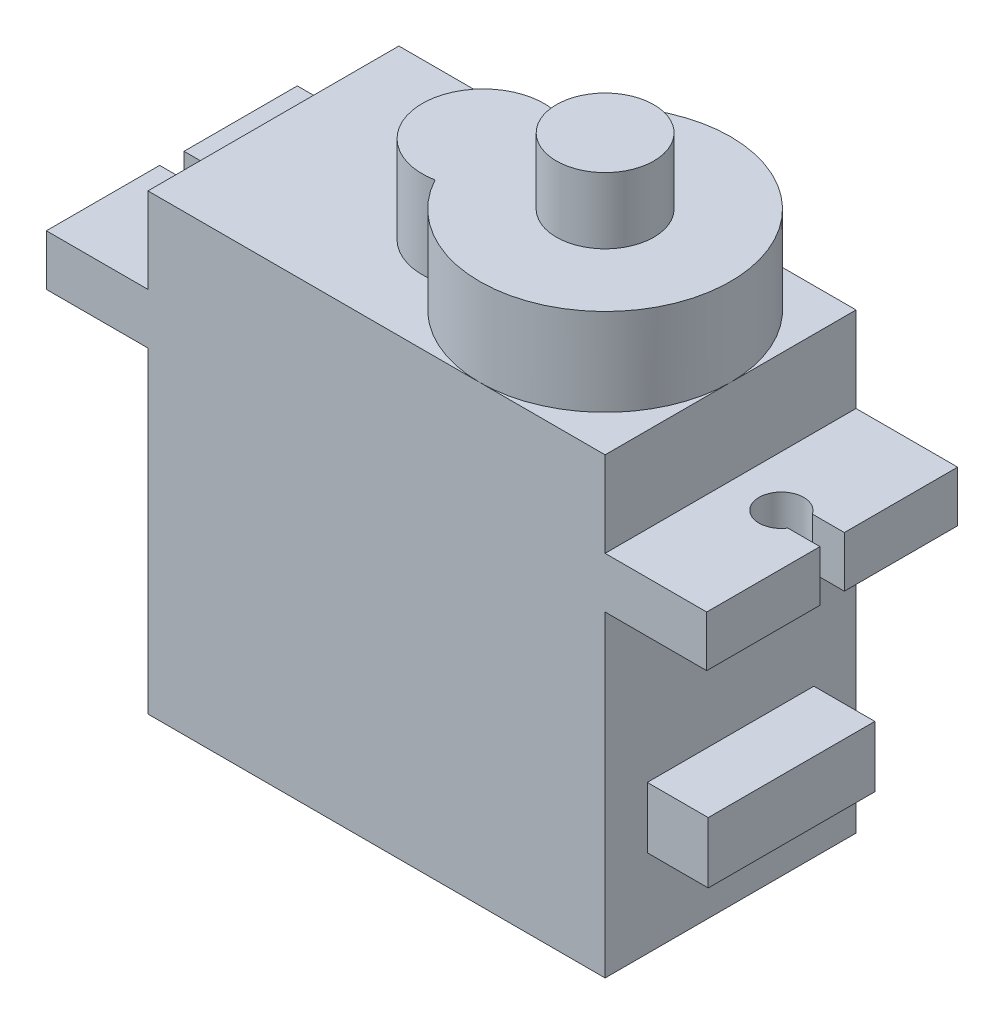
ISO-10303-21;
HEADER;
FILE_DESCRIPTION(('STEP AP214'),'2;1');
FILE_NAME('part.step','',(''),(''),'','','');
FILE_SCHEMA(('AUTOMOTIVE_DESIGN { 1 0 10303 214 1 1 1 1 }'));
ENDSEC;
DATA;
#1=APPLICATION_CONTEXT('core data for automotive mechanical design processes');
#2=APPLICATION_PROTOCOL_DEFINITION('international standard','automotive_design',2000,#1);
#3=PRODUCT_CONTEXT('',#1,'mechanical');
#4=PRODUCT('Part','Part','',(#3));
#5=PRODUCT_RELATED_PRODUCT_CATEGORY('part','',(#4));
#6=PRODUCT_DEFINITION_FORMATION('','',#4);
#7=PRODUCT_DEFINITION_CONTEXT('part definition',#1,'design');
#8=PRODUCT_DEFINITION('design','',#6,#7);
#9=PRODUCT_DEFINITION_SHAPE('','',#8);
#10=(LENGTH_UNIT() NAMED_UNIT(*) SI_UNIT(.MILLI.,.METRE.));
#11=(NAMED_UNIT(*) PLANE_ANGLE_UNIT() SI_UNIT($,.RADIAN.));
#12=(NAMED_UNIT(*) SI_UNIT($,.STERADIAN.) SOLID_ANGLE_UNIT());
#13=UNCERTAINTY_MEASURE_WITH_UNIT(LENGTH_MEASURE(1.E-05),#10,'distance_accuracy_value','');
#14=(GEOMETRIC_REPRESENTATION_CONTEXT(3) GLOBAL_UNCERTAINTY_ASSIGNED_CONTEXT((#13)) GLOBAL_UNIT_ASSIGNED_CONTEXT((#10,
#11,#12)) REPRESENTATION_CONTEXT('',''));
#15=CARTESIAN_POINT('',(0.,0.,0.));
#16=DIRECTION('',(0.,0.,1.));
#17=DIRECTION('',(1.,0.,0.));
#18=AXIS2_PLACEMENT_3D('',#15,#16,#17);
#19=CARTESIAN_POINT('',(27.5,18.1,12.35));
#20=DIRECTION('',(-1.,0.,0.));
#21=DIRECTION('',(0.,0.,1.));
#22=AXIS2_PLACEMENT_3D('',#19,#20,#21);
#23=PLANE('',#22);
#24=DIRECTION('',(0.,0.,-1.));
#25=VECTOR('',#24,1.);
#26=CARTESIAN_POINT('',(27.5,18.1,12.35));
#27=LINE('',#26,#25);
#28=CARTESIAN_POINT('',(27.5,18.1,5.575));
#29=VERTEX_POINT('',#28);
#30=CARTESIAN_POINT('',(27.5,18.1,0.));
#31=VERTEX_POINT('',#30);
#32=EDGE_CURVE('E243',#29,#31,#27,.T.);
#33=ORIENTED_EDGE('',*,*,#32,.F.);
#34=DIRECTION('',(0.,1.,0.));
#35=VECTOR('',#34,1.);
#36=CARTESIAN_POINT('',(27.5,15.1,5.575));
#37=LINE('',#36,#35);
#38=CARTESIAN_POINT('',(27.5,15.6,5.575));
#39=VERTEX_POINT('',#38);
#40=EDGE_CURVE('E237',#39,#29,#37,.T.);
#41=ORIENTED_EDGE('',*,*,#40,.F.);
#42=DIRECTION('',(0.,0.,-1.));
#43=VECTOR('',#42,1.);
#44=CARTESIAN_POINT('',(27.5,15.6,12.35));
#45=LINE('',#44,#43);
#46=CARTESIAN_POINT('',(27.5,15.6,0.));
#47=VERTEX_POINT('',#46);
#48=EDGE_CURVE('E242',#39,#47,#45,.T.);
#49=ORIENTED_EDGE('',*,*,#48,.T.);
#50=DIRECTION('',(0.,1.,0.));
#51=VECTOR('',#50,1.);
#52=CARTESIAN_POINT('',(27.5,18.1,0.));
#53=LINE('',#52,#51);
#54=EDGE_CURVE('E393',#47,#31,#53,.T.);
#55=ORIENTED_EDGE('',*,*,#54,.T.);
#56=EDGE_LOOP('',(#33,#41,#49,#55));
#57=FACE_BOUND('',#56,.T.);
#58=ADVANCED_FACE('F36',(#57),#23,.F.);
#59=CARTESIAN_POINT('',(-5.,18.1,12.35));
#60=DIRECTION('',(1.,0.,0.));
#61=DIRECTION('',(0.,0.,-1.));
#62=AXIS2_PLACEMENT_3D('',#59,#60,#61);
#63=PLANE('',#62);
#64=DIRECTION('',(0.,0.,-1.));
#65=VECTOR('',#64,1.);
#66=CARTESIAN_POINT('',(-5.,18.1,12.35));
#67=LINE('',#66,#65);
#68=CARTESIAN_POINT('',(-5.,18.1,12.35));
#69=VERTEX_POINT('',#68);
#70=CARTESIAN_POINT('',(-5.,18.1,6.775));
#71=VERTEX_POINT('',#70);
#72=EDGE_CURVE('E420',#69,#71,#67,.T.);
#73=ORIENTED_EDGE('',*,*,#72,.T.);
#74=DIRECTION('',(0.,1.,0.));
#75=VECTOR('',#74,1.);
#76=CARTESIAN_POINT('',(-5.,15.1,6.775));
#77=LINE('',#76,#75);
#78=CARTESIAN_POINT('',(-5.,15.6,6.775));
#79=VERTEX_POINT('',#78);
#80=EDGE_CURVE('E281',#79,#71,#77,.T.);
#81=ORIENTED_EDGE('',*,*,#80,.F.);
#82=DIRECTION('',(0.,0.,-1.));
#83=VECTOR('',#82,1.);
#84=CARTESIAN_POINT('',(-5.,15.6,12.35));
#85=LINE('',#84,#83);
#86=CARTESIAN_POINT('',(-5.,15.6,12.35));
#87=VERTEX_POINT('',#86);
#88=EDGE_CURVE('E417',#87,#79,#85,.T.);
#89=ORIENTED_EDGE('',*,*,#88,.F.);
#90=DIRECTION('',(0.,-1.,0.));
#91=VECTOR('',#90,1.);
#92=CARTESIAN_POINT('',(-5.,18.1,12.35));
#93=LINE('',#92,#91);
#94=EDGE_CURVE('E379',#69,#87,#93,.T.);
#95=ORIENTED_EDGE('',*,*,#94,.F.);
#96=EDGE_LOOP('',(#73,#81,#89,#95));
#97=FACE_BOUND('',#96,.T.);
#98=ADVANCED_FACE('F487',(#97),#63,.F.);
#99=CARTESIAN_POINT('',(22.5,0.,12.35));
#100=DIRECTION('',(-1.,0.,0.));
#101=DIRECTION('',(0.,-1.,0.));
#102=AXIS2_PLACEMENT_3D('',#99,#100,#101);
#103=PLANE('',#102);
#104=DIRECTION('',(0.,1.,0.));
#105=VECTOR('',#104,1.);
#106=CARTESIAN_POINT('',(22.5,0.,0.));
#107=LINE('',#106,#105);
#108=CARTESIAN_POINT('',(22.5,0.,0.));
#109=VERTEX_POINT('',#108);
#110=CARTESIAN_POINT('',(22.5,15.6,0.));
#111=VERTEX_POINT('',#110);
#112=EDGE_CURVE('E388',#109,#111,#107,.T.);
#113=ORIENTED_EDGE('',*,*,#112,.T.);
#114=DIRECTION('',(0.,0.,-1.));
#115=VECTOR('',#114,1.);
#116=CARTESIAN_POINT('',(22.5,15.6,12.35));
#117=LINE('',#116,#115);
#118=CARTESIAN_POINT('',(22.5,15.6,12.35));
#119=VERTEX_POINT('',#118);
#120=EDGE_CURVE('E250',#119,#111,#117,.T.);
#121=ORIENTED_EDGE('',*,*,#120,.F.);
#122=DIRECTION('',(0.,1.,0.));
#123=VECTOR('',#122,1.);
#124=CARTESIAN_POINT('',(22.5,0.,12.35));
#125=LINE('',#124,#123);
#126=CARTESIAN_POINT('',(22.5,0.,12.35));
#127=VERTEX_POINT('',#126);
#128=EDGE_CURVE('E362',#127,#119,#125,.T.);
#129=ORIENTED_EDGE('',*,*,#128,.F.);
#130=DIRECTION('',(0.,0.,-1.));
#131=VECTOR('',#130,1.);
#132=CARTESIAN_POINT('',(22.5,0.,12.35));
#133=LINE('',#132,#131);
#134=EDGE_CURVE('E253',#127,#109,#133,.T.);
#135=ORIENTED_EDGE('',*,*,#134,.T.);
#136=EDGE_LOOP('',(#113,#121,#129,#135));
#137=FACE_BOUND('',#136,.T.);
#138=DIRECTION('',(0.,-1.,0.));
#139=VECTOR('',#138,1.);
#140=CARTESIAN_POINT('',(22.5,7.30000000000001,10.275));
#141=LINE('',#140,#139);
#142=CARTESIAN_POINT('',(22.5,7.30000000000001,10.275));
#143=VERTEX_POINT('',#142);
#144=CARTESIAN_POINT('',(22.5,4.30000000000001,10.275));
#145=VERTEX_POINT('',#144);
#146=EDGE_CURVE('E299',#143,#145,#141,.T.);
#147=ORIENTED_EDGE('',*,*,#146,.F.);
#148=DIRECTION('',(0.,0.,1.));
#149=VECTOR('',#148,1.);
#150=CARTESIAN_POINT('',(22.5,7.30000000000001,10.275));
#151=LINE('',#150,#149);
#152=CARTESIAN_POINT('',(22.5,7.30000000000001,2.075));
#153=VERTEX_POINT('',#152);
#154=EDGE_CURVE('E304',#153,#143,#151,.T.);
#155=ORIENTED_EDGE('',*,*,#154,.F.);
#156=DIRECTION('',(0.,1.,0.));
#157=VECTOR('',#156,1.);
#158=CARTESIAN_POINT('',(22.5,7.30000000000001,2.075));
#159=LINE('',#158,#157);
#160=CARTESIAN_POINT('',(22.5,4.30000000000001,2.075));
#161=VERTEX_POINT('',#160);
#162=EDGE_CURVE('E316',#161,#153,#159,.T.);
#163=ORIENTED_EDGE('',*,*,#162,.F.);
#164=DIRECTION('',(0.,0.,-1.));
#165=VECTOR('',#164,1.);
#166=CARTESIAN_POINT('',(22.5,4.30000000000001,10.275));
#167=LINE('',#166,#165);
#168=EDGE_CURVE('E313',#145,#161,#167,.T.);
#169=ORIENTED_EDGE('',*,*,#168,.F.);
#170=EDGE_LOOP('',(#147,#155,#163,#169));
#171=FACE_BOUND('',#170,.T.);
#172=ADVANCED_FACE('F482',(#137,#171),#103,.F.);
#173=CARTESIAN_POINT('',(22.5,22.3,12.35));
#174=DIRECTION('',(0.,-1.,0.));
#175=DIRECTION('',(1.,0.,0.));
#176=AXIS2_PLACEMENT_3D('',#173,#174,#175);
#177=PLANE('',#176);
#178=CARTESIAN_POINT('',(10.325,22.3,6.175));
#179=DIRECTION('',(0.,1.,0.));
#180=DIRECTION('',(-1.,0.,0.));
#181=AXIS2_PLACEMENT_3D('',#178,#179,#180);
#182=CIRCLE('',#181,3.);
#183=CARTESIAN_POINT('',(10.8974479166667,22.3,3.23012251821845));
#184=VERTEX_POINT('',#183);
#185=CARTESIAN_POINT('',(10.8974479166667,22.3,9.11987748178154));
#186=VERTEX_POINT('',#185);
#187=EDGE_CURVE('E336',#184,#186,#182,.T.);
#188=ORIENTED_EDGE('',*,*,#187,.F.);
#189=CARTESIAN_POINT('',(16.325,22.3,6.175));
#190=DIRECTION('',(0.,1.,0.));
#191=DIRECTION('',(-1.,0.,0.));
#192=AXIS2_PLACEMENT_3D('',#189,#190,#191);
#193=CIRCLE('',#192,6.175);
#194=CARTESIAN_POINT('',(16.325,22.3,0.));
#195=VERTEX_POINT('',#194);
#196=EDGE_CURVE('E259',#195,#184,#193,.T.);
#197=ORIENTED_EDGE('',*,*,#196,.F.);
#198=DIRECTION('',(-1.,0.,0.));
#199=VECTOR('',#198,1.);
#200=CARTESIAN_POINT('',(22.5,22.3,0.));
#201=LINE('',#200,#199);
#202=CARTESIAN_POINT('',(0.,22.3,0.));
#203=VERTEX_POINT('',#202);
#204=EDGE_CURVE('E401',#195,#203,#201,.T.);
#205=ORIENTED_EDGE('',*,*,#204,.T.);
#206=DIRECTION('',(0.,0.,-1.));
#207=VECTOR('',#206,1.);
#208=CARTESIAN_POINT('',(0.,22.3,12.35));
#209=LINE('',#208,#207);
#210=CARTESIAN_POINT('',(0.,22.3,12.35));
#211=VERTEX_POINT('',#210);
#212=EDGE_CURVE('E426',#211,#203,#209,.T.);
#213=ORIENTED_EDGE('',*,*,#212,.F.);
#214=DIRECTION('',(-1.,0.,0.));
#215=VECTOR('',#214,1.);
#216=CARTESIAN_POINT('',(22.5,22.3,12.35));
#217=LINE('',#216,#215);
#218=CARTESIAN_POINT('',(16.325,22.3,12.35));
#219=VERTEX_POINT('',#218);
#220=EDGE_CURVE('E371',#219,#211,#217,.T.);
#221=ORIENTED_EDGE('',*,*,#220,.F.);
#222=EDGE_CURVE('E343',#186,#219,#193,.T.);
#223=ORIENTED_EDGE('',*,*,#222,.F.);
#224=EDGE_LOOP('',(#188,#197,#205,#213,#221,#223));
#225=FACE_BOUND('',#224,.T.);
#226=ADVANCED_FACE('F455',(#225),#177,.F.);
#227=CARTESIAN_POINT('',(22.5,22.3,6.175));
#228=VERTEX_POINT('',#227);
#229=EDGE_CURVE('E261',#219,#228,#193,.T.);
#230=ORIENTED_EDGE('',*,*,#229,.F.);
#231=CARTESIAN_POINT('',(22.5,22.3,12.35));
#232=VERTEX_POINT('',#231);
#233=EDGE_CURVE('E372',#232,#219,#217,.T.);
#234=ORIENTED_EDGE('',*,*,#233,.F.);
#235=DIRECTION('',(0.,0.,-1.));
#236=VECTOR('',#235,1.);
#237=CARTESIAN_POINT('',(22.5,22.3,12.35));
#238=LINE('',#237,#236);
#239=EDGE_CURVE('E429',#232,#228,#238,.T.);
#240=ORIENTED_EDGE('',*,*,#239,.T.);
#241=EDGE_LOOP('',(#230,#234,#240));
#242=FACE_BOUND('',#241,.T.);
#243=ADVANCED_FACE('F473',(#242),#177,.F.);
#244=CARTESIAN_POINT('',(0.,15.6,12.35));
#245=DIRECTION('',(1.,0.,0.));
#246=DIRECTION('',(0.,1.,0.));
#247=AXIS2_PLACEMENT_3D('',#244,#245,#246);
#248=PLANE('',#247);
#249=DIRECTION('',(0.,-1.,0.));
#250=VECTOR('',#249,1.);
#251=CARTESIAN_POINT('',(0.,15.6,0.));
#252=LINE('',#251,#250);
#253=CARTESIAN_POINT('',(0.,15.6,0.));
#254=VERTEX_POINT('',#253);
#255=CARTESIAN_POINT('',(0.,0.,0.));
#256=VERTEX_POINT('',#255);
#257=EDGE_CURVE('E355',#254,#256,#252,.T.);
#258=ORIENTED_EDGE('',*,*,#257,.T.);
#259=DIRECTION('',(0.,0.,-1.));
#260=VECTOR('',#259,1.);
#261=CARTESIAN_POINT('',(0.,0.,12.35));
#262=LINE('',#261,#260);
#263=CARTESIAN_POINT('',(0.,0.,12.35));
#264=VERTEX_POINT('',#263);
#265=EDGE_CURVE('E256',#264,#256,#262,.T.);
#266=ORIENTED_EDGE('',*,*,#265,.F.);
#267=DIRECTION('',(0.,-1.,0.));
#268=VECTOR('',#267,1.);
#269=CARTESIAN_POINT('',(0.,15.6,12.35));
#270=LINE('',#269,#268);
#271=CARTESIAN_POINT('',(0.,15.6,12.35));
#272=VERTEX_POINT('',#271);
#273=EDGE_CURVE('E356',#272,#264,#270,.T.);
#274=ORIENTED_EDGE('',*,*,#273,.F.);
#275=DIRECTION('',(0.,0.,-1.));
#276=VECTOR('',#275,1.);
#277=CARTESIAN_POINT('',(0.,15.6,12.35));
#278=LINE('',#277,#276);
#279=EDGE_CURVE('E383',#272,#254,#278,.T.);
#280=ORIENTED_EDGE('',*,*,#279,.T.);
#281=EDGE_LOOP('',(#258,#266,#274,#280));
#282=FACE_BOUND('',#281,.T.);
#283=ADVANCED_FACE('F38',(#282),#248,.F.);
#284=CARTESIAN_POINT('',(0.,0.,12.35));
#285=DIRECTION('',(0.,1.,0.));
#286=DIRECTION('',(0.,0.,1.));
#287=AXIS2_PLACEMENT_3D('',#284,#285,#286);
#288=PLANE('',#287);
#289=DIRECTION('',(1.,0.,0.));
#290=VECTOR('',#289,1.);
#291=CARTESIAN_POINT('',(0.,0.,0.));
#292=LINE('',#291,#290);
#293=EDGE_CURVE('E386',#256,#109,#292,.T.);
#294=ORIENTED_EDGE('',*,*,#293,.T.);
#295=ORIENTED_EDGE('',*,*,#134,.F.);
#296=DIRECTION('',(1.,0.,0.));
#297=VECTOR('',#296,1.);
#298=CARTESIAN_POINT('',(0.,0.,12.35));
#299=LINE('',#298,#297);
#300=EDGE_CURVE('E359',#264,#127,#299,.T.);
#301=ORIENTED_EDGE('',*,*,#300,.F.);
#302=ORIENTED_EDGE('',*,*,#265,.T.);
#303=EDGE_LOOP('',(#294,#295,#301,#302));
#304=FACE_BOUND('',#303,.T.);
#305=ADVANCED_FACE('F480',(#304),#288,.F.);
#306=CARTESIAN_POINT('',(27.5,15.6,12.35));
#307=DIRECTION('',(0.,1.,0.));
#308=DIRECTION('',(0.,0.,1.));
#309=AXIS2_PLACEMENT_3D('',#306,#307,#308);
#310=PLANE('',#309);
#311=ORIENTED_EDGE('',*,*,#48,.F.);
#312=DIRECTION('',(-1.,0.,0.));
#313=VECTOR('',#312,1.);
#314=CARTESIAN_POINT('',(27.5,15.6,5.575));
#315=LINE('',#314,#313);
#316=CARTESIAN_POINT('',(25.9219544457293,15.6,5.575));
#317=VERTEX_POINT('',#316);
#318=EDGE_CURVE('E292',#39,#317,#315,.T.);
#319=ORIENTED_EDGE('',*,*,#318,.T.);
#320=CARTESIAN_POINT('',(25.,15.6,6.175));
#321=DIRECTION('',(0.,1.,0.));
#322=DIRECTION('',(0.,0.,1.));
#323=AXIS2_PLACEMENT_3D('',#320,#321,#322);
#324=CIRCLE('',#323,1.1);
#325=CARTESIAN_POINT('',(25.9219544457293,15.6,6.775));
#326=VERTEX_POINT('',#325);
#327=EDGE_CURVE('E296',#317,#326,#324,.T.);
#328=ORIENTED_EDGE('',*,*,#327,.T.);
#329=DIRECTION('',(1.,0.,0.));
#330=VECTOR('',#329,1.);
#331=CARTESIAN_POINT('',(27.5,15.6,6.775));
#332=LINE('',#331,#330);
#333=CARTESIAN_POINT('',(27.5,15.6,6.775));
#334=VERTEX_POINT('',#333);
#335=EDGE_CURVE('E290',#326,#334,#332,.T.);
#336=ORIENTED_EDGE('',*,*,#335,.T.);
#337=CARTESIAN_POINT('',(27.5,15.6,12.35));
#338=VERTEX_POINT('',#337);
#339=EDGE_CURVE('E236',#338,#334,#45,.T.);
#340=ORIENTED_EDGE('',*,*,#339,.F.);
#341=DIRECTION('',(1.,0.,0.));
#342=VECTOR('',#341,1.);
#343=CARTESIAN_POINT('',(27.5,15.6,12.35));
#344=LINE('',#343,#342);
#345=EDGE_CURVE('E364',#119,#338,#344,.T.);
#346=ORIENTED_EDGE('',*,*,#345,.F.);
#347=ORIENTED_EDGE('',*,*,#120,.T.);
#348=DIRECTION('',(1.,0.,0.));
#349=VECTOR('',#348,1.);
#350=CARTESIAN_POINT('',(27.5,15.6,0.));
#351=LINE('',#350,#349);
#352=EDGE_CURVE('E390',#111,#47,#351,.T.);
#353=ORIENTED_EDGE('',*,*,#352,.T.);
#354=EDGE_LOOP('',(#311,#319,#328,#336,#340,#346,#347,#353));
#355=FACE_BOUND('',#354,.T.);
#356=ADVANCED_FACE('F500',(#355),#310,.F.);
#357=ORIENTED_EDGE('',*,*,#339,.T.);
#358=DIRECTION('',(0.,1.,0.));
#359=VECTOR('',#358,1.);
#360=CARTESIAN_POINT('',(27.5,15.1,6.775));
#361=LINE('',#360,#359);
#362=CARTESIAN_POINT('',(27.5,18.1,6.775));
#363=VERTEX_POINT('',#362);
#364=EDGE_CURVE('E221',#334,#363,#361,.T.);
#365=ORIENTED_EDGE('',*,*,#364,.T.);
#366=CARTESIAN_POINT('',(27.5,18.1,12.35));
#367=VERTEX_POINT('',#366);
#368=EDGE_CURVE('E233',#367,#363,#27,.T.);
#369=ORIENTED_EDGE('',*,*,#368,.F.);
#370=DIRECTION('',(0.,1.,0.));
#371=VECTOR('',#370,1.);
#372=CARTESIAN_POINT('',(27.5,18.1,12.35));
#373=LINE('',#372,#371);
#374=EDGE_CURVE('E366',#338,#367,#373,.T.);
#375=ORIENTED_EDGE('',*,*,#374,.F.);
#376=EDGE_LOOP('',(#357,#365,#369,#375));
#377=FACE_BOUND('',#376,.T.);
#378=ADVANCED_FACE('F231',(#377),#23,.F.);
#379=CARTESIAN_POINT('',(22.5,18.1,12.35));
#380=DIRECTION('',(0.,-1.,0.));
#381=DIRECTION('',(1.,0.,0.));
#382=AXIS2_PLACEMENT_3D('',#379,#380,#381);
#383=PLANE('',#382);
#384=CARTESIAN_POINT('',(25.,18.1,6.175));
#385=DIRECTION('',(0.,1.,0.));
#386=DIRECTION('',(-1.,0.,0.));
#387=AXIS2_PLACEMENT_3D('',#384,#385,#386);
#388=CIRCLE('',#387,1.1);
#389=CARTESIAN_POINT('',(25.9219544457293,18.1,5.575));
#390=VERTEX_POINT('',#389);
#391=CARTESIAN_POINT('',(25.9219544457293,18.1,6.775));
#392=VERTEX_POINT('',#391);
#393=EDGE_CURVE('E51',#390,#392,#388,.T.);
#394=ORIENTED_EDGE('',*,*,#393,.F.);
#395=DIRECTION('',(-1.,0.,0.));
#396=VECTOR('',#395,1.);
#397=CARTESIAN_POINT('',(27.5,18.1,5.575));
#398=LINE('',#397,#396);
#399=EDGE_CURVE('E226',#29,#390,#398,.T.);
#400=ORIENTED_EDGE('',*,*,#399,.F.);
#401=ORIENTED_EDGE('',*,*,#32,.T.);
#402=DIRECTION('',(-1.,0.,0.));
#403=VECTOR('',#402,1.);
#404=CARTESIAN_POINT('',(22.5,18.1,0.));
#405=LINE('',#404,#403);
#406=CARTESIAN_POINT('',(22.5,18.1,0.));
#407=VERTEX_POINT('',#406);
#408=EDGE_CURVE('E396',#31,#407,#405,.T.);
#409=ORIENTED_EDGE('',*,*,#408,.T.);
#410=DIRECTION('',(0.,0.,-1.));
#411=VECTOR('',#410,1.);
#412=CARTESIAN_POINT('',(22.5,18.1,12.35));
#413=LINE('',#412,#411);
#414=CARTESIAN_POINT('',(22.5,18.1,12.35));
#415=VERTEX_POINT('',#414);
#416=EDGE_CURVE('E246',#415,#407,#413,.T.);
#417=ORIENTED_EDGE('',*,*,#416,.F.);
#418=DIRECTION('',(-1.,0.,0.));
#419=VECTOR('',#418,1.);
#420=CARTESIAN_POINT('',(22.5,18.1,12.35));
#421=LINE('',#420,#419);
#422=EDGE_CURVE('E241',#367,#415,#421,.T.);
#423=ORIENTED_EDGE('',*,*,#422,.F.);
#424=ORIENTED_EDGE('',*,*,#368,.T.);
#425=DIRECTION('',(1.,0.,0.));
#426=VECTOR('',#425,1.);
#427=CARTESIAN_POINT('',(25.9219544457293,18.1,6.775));
#428=LINE('',#427,#426);
#429=EDGE_CURVE('E218',#392,#363,#428,.T.);
#430=ORIENTED_EDGE('',*,*,#429,.F.);
#431=EDGE_LOOP('',(#394,#400,#401,#409,#417,#423,#424,#430));
#432=FACE_BOUND('',#431,.T.);
#433=ADVANCED_FACE('F239',(#432),#383,.F.);
#434=CARTESIAN_POINT('',(22.5,18.1,12.35));
#435=DIRECTION('',(-1.,0.,0.));
#436=DIRECTION('',(0.,0.,1.));
#437=AXIS2_PLACEMENT_3D('',#434,#435,#436);
#438=PLANE('',#437);
#439=DIRECTION('',(0.,1.,0.));
#440=VECTOR('',#439,1.);
#441=CARTESIAN_POINT('',(22.5,18.1,0.));
#442=LINE('',#441,#440);
#443=CARTESIAN_POINT('',(22.5,22.3,0.));
#444=VERTEX_POINT('',#443);
#445=EDGE_CURVE('E398',#407,#444,#442,.T.);
#446=ORIENTED_EDGE('',*,*,#445,.T.);
#447=EDGE_CURVE('E428',#228,#444,#238,.T.);
#448=ORIENTED_EDGE('',*,*,#447,.F.);
#449=ORIENTED_EDGE('',*,*,#239,.F.);
#450=DIRECTION('',(0.,1.,0.));
#451=VECTOR('',#450,1.);
#452=CARTESIAN_POINT('',(22.5,18.1,12.35));
#453=LINE('',#452,#451);
#454=EDGE_CURVE('E369',#415,#232,#453,.T.);
#455=ORIENTED_EDGE('',*,*,#454,.F.);
#456=ORIENTED_EDGE('',*,*,#416,.T.);
#457=EDGE_LOOP('',(#446,#448,#449,#455,#456));
#458=FACE_BOUND('',#457,.T.);
#459=ADVANCED_FACE('F444',(#458),#438,.F.);
#460=EDGE_CURVE('E441',#228,#195,#193,.T.);
#461=ORIENTED_EDGE('',*,*,#460,.F.);
#462=ORIENTED_EDGE('',*,*,#447,.T.);
#463=EDGE_CURVE('E402',#444,#195,#201,.T.);
#464=ORIENTED_EDGE('',*,*,#463,.T.);
#465=EDGE_LOOP('',(#461,#462,#464));
#466=FACE_BOUND('',#465,.T.);
#467=ADVANCED_FACE('F438',(#466),#177,.F.);
#468=CARTESIAN_POINT('',(0.,22.3,12.35));
#469=DIRECTION('',(1.,0.,0.));
#470=DIRECTION('',(0.,1.,0.));
#471=AXIS2_PLACEMENT_3D('',#468,#469,#470);
#472=PLANE('',#471);
#473=DIRECTION('',(0.,-1.,0.));
#474=VECTOR('',#473,1.);
#475=CARTESIAN_POINT('',(0.,22.3,0.));
#476=LINE('',#475,#474);
#477=CARTESIAN_POINT('',(0.,18.1,0.));
#478=VERTEX_POINT('',#477);
#479=EDGE_CURVE('E405',#203,#478,#476,.T.);
#480=ORIENTED_EDGE('',*,*,#479,.T.);
#481=DIRECTION('',(0.,0.,-1.));
#482=VECTOR('',#481,1.);
#483=CARTESIAN_POINT('',(0.,18.1,12.35));
#484=LINE('',#483,#482);
#485=CARTESIAN_POINT('',(0.,18.1,12.35));
#486=VERTEX_POINT('',#485);
#487=EDGE_CURVE('E423',#486,#478,#484,.T.);
#488=ORIENTED_EDGE('',*,*,#487,.F.);
#489=DIRECTION('',(0.,-1.,0.));
#490=VECTOR('',#489,1.);
#491=CARTESIAN_POINT('',(0.,22.3,12.35));
#492=LINE('',#491,#490);
#493=EDGE_CURVE('E375',#211,#486,#492,.T.);
#494=ORIENTED_EDGE('',*,*,#493,.F.);
#495=ORIENTED_EDGE('',*,*,#212,.T.);
#496=EDGE_LOOP('',(#480,#488,#494,#495));
#497=FACE_BOUND('',#496,.T.);
#498=ADVANCED_FACE('F460',(#497),#472,.F.);
#499=CARTESIAN_POINT('',(0.,18.1,12.35));
#500=DIRECTION('',(0.,-1.,0.));
#501=DIRECTION('',(0.,0.,-1.));
#502=AXIS2_PLACEMENT_3D('',#499,#500,#501);
#503=PLANE('',#502);
#504=CARTESIAN_POINT('',(-2.5,18.1,6.175));
#505=DIRECTION('',(0.,1.,0.));
#506=DIRECTION('',(-1.,0.,0.));
#507=AXIS2_PLACEMENT_3D('',#504,#505,#506);
#508=CIRCLE('',#507,1.1);
#509=CARTESIAN_POINT('',(-3.42195444572929,18.1,6.775));
#510=VERTEX_POINT('',#509);
#511=CARTESIAN_POINT('',(-3.42195444572929,18.1,5.575));
#512=VERTEX_POINT('',#511);
#513=EDGE_CURVE('E798',#510,#512,#508,.T.);
#514=ORIENTED_EDGE('',*,*,#513,.F.);
#515=DIRECTION('',(1.,0.,0.));
#516=VECTOR('',#515,1.);
#517=CARTESIAN_POINT('',(-3.42195444572929,18.1,6.775));
#518=LINE('',#517,#516);
#519=EDGE_CURVE('E279',#71,#510,#518,.T.);
#520=ORIENTED_EDGE('',*,*,#519,.F.);
#521=ORIENTED_EDGE('',*,*,#72,.F.);
#522=DIRECTION('',(-1.,0.,0.));
#523=VECTOR('',#522,1.);
#524=CARTESIAN_POINT('',(0.,18.1,12.35));
#525=LINE('',#524,#523);
#526=EDGE_CURVE('E377',#486,#69,#525,.T.);
#527=ORIENTED_EDGE('',*,*,#526,.F.);
#528=ORIENTED_EDGE('',*,*,#487,.T.);
#529=DIRECTION('',(-1.,0.,0.));
#530=VECTOR('',#529,1.);
#531=CARTESIAN_POINT('',(0.,18.1,0.));
#532=LINE('',#531,#530);
#533=CARTESIAN_POINT('',(-5.,18.1,0.));
#534=VERTEX_POINT('',#533);
#535=EDGE_CURVE('E407',#478,#534,#532,.T.);
#536=ORIENTED_EDGE('',*,*,#535,.T.);
#537=CARTESIAN_POINT('',(-5.,18.1,5.575));
#538=VERTEX_POINT('',#537);
#539=EDGE_CURVE('E419',#538,#534,#67,.T.);
#540=ORIENTED_EDGE('',*,*,#539,.F.);
#541=DIRECTION('',(-1.,0.,0.));
#542=VECTOR('',#541,1.);
#543=CARTESIAN_POINT('',(-3.42195444572929,18.1,5.575));
#544=LINE('',#543,#542);
#545=EDGE_CURVE('E799',#512,#538,#544,.T.);
#546=ORIENTED_EDGE('',*,*,#545,.F.);
#547=EDGE_LOOP('',(#514,#520,#521,#527,#528,#536,#540,#546));
#548=FACE_BOUND('',#547,.T.);
#549=ADVANCED_FACE('F569',(#548),#503,.F.);
#550=CARTESIAN_POINT('',(-5.,15.6,5.575));
#551=VERTEX_POINT('',#550);
#552=CARTESIAN_POINT('',(-5.,15.6,0.));
#553=VERTEX_POINT('',#552);
#554=EDGE_CURVE('E416',#551,#553,#85,.T.);
#555=ORIENTED_EDGE('',*,*,#554,.F.);
#556=DIRECTION('',(0.,1.,0.));
#557=VECTOR('',#556,1.);
#558=CARTESIAN_POINT('',(-5.,15.1,5.575));
#559=LINE('',#558,#557);
#560=EDGE_CURVE('E59',#551,#538,#559,.T.);
#561=ORIENTED_EDGE('',*,*,#560,.T.);
#562=ORIENTED_EDGE('',*,*,#539,.T.);
#563=DIRECTION('',(0.,-1.,0.));
#564=VECTOR('',#563,1.);
#565=CARTESIAN_POINT('',(-5.,18.1,0.));
#566=LINE('',#565,#564);
#567=EDGE_CURVE('E410',#534,#553,#566,.T.);
#568=ORIENTED_EDGE('',*,*,#567,.T.);
#569=EDGE_LOOP('',(#555,#561,#562,#568));
#570=FACE_BOUND('',#569,.T.);
#571=ADVANCED_FACE('F495',(#570),#63,.F.);
#572=CARTESIAN_POINT('',(-5.,15.6,12.35));
#573=DIRECTION('',(0.,1.,0.));
#574=DIRECTION('',(0.,0.,1.));
#575=AXIS2_PLACEMENT_3D('',#572,#573,#574);
#576=PLANE('',#575);
#577=ORIENTED_EDGE('',*,*,#88,.T.);
#578=DIRECTION('',(1.,0.,0.));
#579=VECTOR('',#578,1.);
#580=CARTESIAN_POINT('',(-5.,15.6,6.775));
#581=LINE('',#580,#579);
#582=CARTESIAN_POINT('',(-3.42195444572929,15.6,6.775));
#583=VERTEX_POINT('',#582);
#584=EDGE_CURVE('E11',#79,#583,#581,.T.);
#585=ORIENTED_EDGE('',*,*,#584,.T.);
#586=CARTESIAN_POINT('',(-2.5,15.6,6.175));
#587=DIRECTION('',(0.,1.,0.));
#588=DIRECTION('',(0.,0.,1.));
#589=AXIS2_PLACEMENT_3D('',#586,#587,#588);
#590=CIRCLE('',#589,1.1);
#591=CARTESIAN_POINT('',(-3.42195444572929,15.6,5.575));
#592=VERTEX_POINT('',#591);
#593=EDGE_CURVE('E44',#583,#592,#590,.T.);
#594=ORIENTED_EDGE('',*,*,#593,.T.);
#595=DIRECTION('',(-1.,0.,0.));
#596=VECTOR('',#595,1.);
#597=CARTESIAN_POINT('',(-5.,15.6,5.575));
#598=LINE('',#597,#596);
#599=EDGE_CURVE('E260',#592,#551,#598,.T.);
#600=ORIENTED_EDGE('',*,*,#599,.T.);
#601=ORIENTED_EDGE('',*,*,#554,.T.);
#602=DIRECTION('',(1.,0.,0.));
#603=VECTOR('',#602,1.);
#604=CARTESIAN_POINT('',(-5.,15.6,0.));
#605=LINE('',#604,#603);
#606=EDGE_CURVE('E360',#553,#254,#605,.T.);
#607=ORIENTED_EDGE('',*,*,#606,.T.);
#608=ORIENTED_EDGE('',*,*,#279,.F.);
#609=DIRECTION('',(1.,0.,0.));
#610=VECTOR('',#609,1.);
#611=CARTESIAN_POINT('',(-5.,15.6,12.35));
#612=LINE('',#611,#610);
#613=EDGE_CURVE('E381',#87,#272,#612,.T.);
#614=ORIENTED_EDGE('',*,*,#613,.F.);
#615=EDGE_LOOP('',(#577,#585,#594,#600,#601,#607,#608,#614));
#616=FACE_BOUND('',#615,.T.);
#617=ADVANCED_FACE('F265',(#616),#576,.F.);
#618=CARTESIAN_POINT('',(0.,0.,12.35));
#619=DIRECTION('',(0.,0.,1.));
#620=DIRECTION('',(1.,0.,0.));
#621=AXIS2_PLACEMENT_3D('',#618,#619,#620);
#622=PLANE('',#621);
#623=ORIENTED_EDGE('',*,*,#273,.T.);
#624=ORIENTED_EDGE('',*,*,#300,.T.);
#625=ORIENTED_EDGE('',*,*,#128,.T.);
#626=ORIENTED_EDGE('',*,*,#345,.T.);
#627=ORIENTED_EDGE('',*,*,#374,.T.);
#628=ORIENTED_EDGE('',*,*,#422,.T.);
#629=ORIENTED_EDGE('',*,*,#454,.T.);
#630=ORIENTED_EDGE('',*,*,#233,.T.);
#631=ORIENTED_EDGE('',*,*,#220,.T.);
#632=ORIENTED_EDGE('',*,*,#493,.T.);
#633=ORIENTED_EDGE('',*,*,#526,.T.);
#634=ORIENTED_EDGE('',*,*,#94,.T.);
#635=ORIENTED_EDGE('',*,*,#613,.T.);
#636=EDGE_LOOP('',(#623,#624,#625,#626,#627,#628,#629,#630,#631,#632,#633,#634,#635));
#637=FACE_BOUND('',#636,.T.);
#638=ADVANCED_FACE('F464',(#637),#622,.T.);
#639=CARTESIAN_POINT('',(0.,0.,0.));
#640=DIRECTION('',(0.,0.,1.));
#641=DIRECTION('',(1.,0.,0.));
#642=AXIS2_PLACEMENT_3D('',#639,#640,#641);
#643=PLANE('',#642);
#644=ORIENTED_EDGE('',*,*,#257,.F.);
#645=ORIENTED_EDGE('',*,*,#606,.F.);
#646=ORIENTED_EDGE('',*,*,#567,.F.);
#647=ORIENTED_EDGE('',*,*,#535,.F.);
#648=ORIENTED_EDGE('',*,*,#479,.F.);
#649=ORIENTED_EDGE('',*,*,#204,.F.);
#650=ORIENTED_EDGE('',*,*,#463,.F.);
#651=ORIENTED_EDGE('',*,*,#445,.F.);
#652=ORIENTED_EDGE('',*,*,#408,.F.);
#653=ORIENTED_EDGE('',*,*,#54,.F.);
#654=ORIENTED_EDGE('',*,*,#352,.F.);
#655=ORIENTED_EDGE('',*,*,#112,.F.);
#656=ORIENTED_EDGE('',*,*,#293,.F.);
#657=EDGE_LOOP('',(#644,#645,#646,#647,#648,#649,#650,#651,#652,#653,#654,#655,#656));
#658=FACE_BOUND('',#657,.T.);
#659=ADVANCED_FACE('F450',(#658),#643,.F.);
#660=CARTESIAN_POINT('',(10.325,26.6,6.175));
#661=DIRECTION('',(0.,-1.,0.));
#662=DIRECTION('',(1.,0.,0.));
#663=AXIS2_PLACEMENT_3D('',#660,#661,#662);
#664=CYLINDRICAL_SURFACE('',#663,3.);
#665=ORIENTED_EDGE('',*,*,#187,.T.);
#666=DIRECTION('',(0.,-1.,0.));
#667=VECTOR('',#666,1.);
#668=CARTESIAN_POINT('',(10.8974479166667,26.6,9.11987748178154));
#669=LINE('',#668,#667);
#670=CARTESIAN_POINT('',(10.8974479166667,26.6,9.11987748178154));
#671=VERTEX_POINT('',#670);
#672=EDGE_CURVE('E352',#671,#186,#669,.T.);
#673=ORIENTED_EDGE('',*,*,#672,.F.);
#674=CARTESIAN_POINT('',(10.325,26.6,6.175));
#675=DIRECTION('',(0.,1.,0.));
#676=DIRECTION('',(-1.,0.,0.));
#677=AXIS2_PLACEMENT_3D('',#674,#675,#676);
#678=CIRCLE('',#677,3.);
#679=CARTESIAN_POINT('',(10.8974479166667,26.6,3.23012251821845));
#680=VERTEX_POINT('',#679);
#681=EDGE_CURVE('E339',#680,#671,#678,.T.);
#682=ORIENTED_EDGE('',*,*,#681,.F.);
#683=DIRECTION('',(0.,-1.,0.));
#684=VECTOR('',#683,1.);
#685=CARTESIAN_POINT('',(10.8974479166667,26.6,3.23012251821845));
#686=LINE('',#685,#684);
#687=EDGE_CURVE('E345',#680,#184,#686,.T.);
#688=ORIENTED_EDGE('',*,*,#687,.T.);
#689=EDGE_LOOP('',(#665,#673,#682,#688));
#690=FACE_BOUND('',#689,.T.);
#691=ADVANCED_FACE('F472',(#690),#664,.T.);
#692=CARTESIAN_POINT('',(16.325,26.6,6.175));
#693=DIRECTION('',(0.,-1.,0.));
#694=DIRECTION('',(1.,0.,0.));
#695=AXIS2_PLACEMENT_3D('',#692,#693,#694);
#696=CYLINDRICAL_SURFACE('',#695,6.175);
#697=ORIENTED_EDGE('',*,*,#222,.T.);
#698=ORIENTED_EDGE('',*,*,#229,.T.);
#699=ORIENTED_EDGE('',*,*,#460,.T.);
#700=ORIENTED_EDGE('',*,*,#196,.T.);
#701=ORIENTED_EDGE('',*,*,#687,.F.);
#702=CARTESIAN_POINT('',(16.325,26.6,6.175));
#703=DIRECTION('',(0.,1.,0.));
#704=DIRECTION('',(-1.,0.,0.));
#705=AXIS2_PLACEMENT_3D('',#702,#703,#704);
#706=CIRCLE('',#705,6.175);
#707=EDGE_CURVE('E342',#671,#680,#706,.T.);
#708=ORIENTED_EDGE('',*,*,#707,.F.);
#709=ORIENTED_EDGE('',*,*,#672,.T.);
#710=EDGE_LOOP('',(#697,#698,#699,#700,#701,#708,#709));
#711=FACE_BOUND('',#710,.T.);
#712=ADVANCED_FACE('F468',(#711),#696,.T.);
#713=CARTESIAN_POINT('',(13.325,26.6,6.175));
#714=DIRECTION('',(0.,1.,0.));
#715=DIRECTION('',(-1.,0.,0.));
#716=AXIS2_PLACEMENT_3D('',#713,#714,#715);
#717=PLANE('',#716);
#718=CARTESIAN_POINT('',(16.325,26.6,6.175));
#719=DIRECTION('',(0.,1.,0.));
#720=DIRECTION('',(-1.,0.,0.));
#721=AXIS2_PLACEMENT_3D('',#718,#719,#720);
#722=CIRCLE('',#721,2.4);
#723=CARTESIAN_POINT('',(18.725,26.6,6.175));
#724=VERTEX_POINT('',#723);
#725=EDGE_CURVE('E332',#724,#724,#722,.T.);
#726=ORIENTED_EDGE('',*,*,#725,.F.);
#727=EDGE_LOOP('',(#726));
#728=FACE_BOUND('',#727,.T.);
#729=ORIENTED_EDGE('',*,*,#681,.T.);
#730=ORIENTED_EDGE('',*,*,#707,.T.);
#731=EDGE_LOOP('',(#729,#730));
#732=FACE_BOUND('',#731,.T.);
#733=ADVANCED_FACE('F553',(#728,#732),#717,.T.);
#734=CARTESIAN_POINT('',(16.325,29.85,6.175));
#735=DIRECTION('',(0.,-1.,0.));
#736=DIRECTION('',(1.,0.,0.));
#737=AXIS2_PLACEMENT_3D('',#734,#735,#736);
#738=CYLINDRICAL_SURFACE('',#737,2.4);
#739=CARTESIAN_POINT('',(16.325,29.85,6.175));
#740=DIRECTION('',(0.,1.,0.));
#741=DIRECTION('',(-1.,0.,0.));
#742=AXIS2_PLACEMENT_3D('',#739,#740,#741);
#743=CIRCLE('',#742,2.4);
#744=CARTESIAN_POINT('',(18.725,29.85,6.175));
#745=VERTEX_POINT('',#744);
#746=EDGE_CURVE('E333',#745,#745,#743,.T.);
#747=CARTESIAN_POINT('',(18.725,29.85,6.175));
#748=CARTESIAN_POINT('',(18.725,29.8161458333333,6.175));
#749=CARTESIAN_POINT('',(18.725,29.7822916666667,6.175));
#750=CARTESIAN_POINT('',(18.725,29.7145833333333,6.175));
#751=CARTESIAN_POINT('',(18.725,29.6807291666667,6.175));
#752=CARTESIAN_POINT('',(18.725,29.6130208333333,6.175));
#753=CARTESIAN_POINT('',(18.725,29.5791666666667,6.175));
#754=CARTESIAN_POINT('',(18.725,29.5114583333333,6.175));
#755=CARTESIAN_POINT('',(18.725,29.4776041666667,6.175));
#756=CARTESIAN_POINT('',(18.725,29.4098958333333,6.175));
#757=CARTESIAN_POINT('',(18.725,29.3760416666667,6.175));
#758=CARTESIAN_POINT('',(18.725,29.3083333333333,6.175));
#759=CARTESIAN_POINT('',(18.725,29.2744791666667,6.175));
#760=CARTESIAN_POINT('',(18.725,29.2067708333333,6.175));
#761=CARTESIAN_POINT('',(18.725,29.1729166666667,6.175));
#762=CARTESIAN_POINT('',(18.725,29.1052083333333,6.175));
#763=CARTESIAN_POINT('',(18.725,29.0713541666667,6.175));
#764=CARTESIAN_POINT('',(18.725,29.0036458333333,6.175));
#765=CARTESIAN_POINT('',(18.725,28.9697916666667,6.175));
#766=CARTESIAN_POINT('',(18.725,28.9020833333333,6.175));
#767=CARTESIAN_POINT('',(18.725,28.8682291666667,6.175));
#768=CARTESIAN_POINT('',(18.725,28.8005208333333,6.175));
#769=CARTESIAN_POINT('',(18.725,28.7666666666667,6.175));
#770=CARTESIAN_POINT('',(18.725,28.6989583333333,6.175));
#771=CARTESIAN_POINT('',(18.725,28.6651041666667,6.175));
#772=CARTESIAN_POINT('',(18.725,28.5973958333333,6.175));
#773=CARTESIAN_POINT('',(18.725,28.5635416666667,6.175));
#774=CARTESIAN_POINT('',(18.725,28.4958333333333,6.175));
#775=CARTESIAN_POINT('',(18.725,28.4619791666667,6.175));
#776=CARTESIAN_POINT('',(18.725,28.3942708333333,6.175));
#777=CARTESIAN_POINT('',(18.725,28.3604166666667,6.175));
#778=CARTESIAN_POINT('',(18.725,28.2927083333333,6.175));
#779=CARTESIAN_POINT('',(18.725,28.2588541666667,6.175));
#780=CARTESIAN_POINT('',(18.725,28.1911458333333,6.175));
#781=CARTESIAN_POINT('',(18.725,28.1572916666667,6.175));
#782=CARTESIAN_POINT('',(18.725,28.0895833333333,6.175));
#783=CARTESIAN_POINT('',(18.725,28.0557291666667,6.175));
#784=CARTESIAN_POINT('',(18.725,27.9880208333333,6.175));
#785=CARTESIAN_POINT('',(18.725,27.9541666666667,6.175));
#786=CARTESIAN_POINT('',(18.725,27.8864583333333,6.175));
#787=CARTESIAN_POINT('',(18.725,27.8526041666667,6.175));
#788=CARTESIAN_POINT('',(18.725,27.7848958333333,6.175));
#789=CARTESIAN_POINT('',(18.725,27.7510416666667,6.175));
#790=CARTESIAN_POINT('',(18.725,27.6833333333333,6.175));
#791=CARTESIAN_POINT('',(18.725,27.6494791666667,6.175));
#792=CARTESIAN_POINT('',(18.725,27.5817708333333,6.175));
#793=CARTESIAN_POINT('',(18.725,27.5479166666667,6.175));
#794=CARTESIAN_POINT('',(18.725,27.4802083333333,6.175));
#795=CARTESIAN_POINT('',(18.725,27.4463541666667,6.175));
#796=CARTESIAN_POINT('',(18.725,27.3786458333333,6.175));
#797=CARTESIAN_POINT('',(18.725,27.3447916666667,6.175));
#798=CARTESIAN_POINT('',(18.725,27.2770833333333,6.175));
#799=CARTESIAN_POINT('',(18.725,27.2432291666667,6.175));
#800=CARTESIAN_POINT('',(18.725,27.1755208333333,6.175));
#801=CARTESIAN_POINT('',(18.725,27.1416666666667,6.175));
#802=CARTESIAN_POINT('',(18.725,27.0739583333333,6.175));
#803=CARTESIAN_POINT('',(18.725,27.0401041666667,6.175));
#804=CARTESIAN_POINT('',(18.725,26.9723958333333,6.175));
#805=CARTESIAN_POINT('',(18.725,26.9385416666667,6.175));
#806=CARTESIAN_POINT('',(18.725,26.8708333333333,6.175));
#807=CARTESIAN_POINT('',(18.725,26.8369791666667,6.175));
#808=CARTESIAN_POINT('',(18.725,26.7692708333333,6.175));
#809=CARTESIAN_POINT('',(18.725,26.7354166666667,6.175));
#810=CARTESIAN_POINT('',(18.725,26.6677083333333,6.175));
#811=CARTESIAN_POINT('',(18.725,26.6338541666667,6.175));
#812=CARTESIAN_POINT('',(18.725,26.6,6.175));
#813=B_SPLINE_CURVE_WITH_KNOTS('',3,(#747,#748,#749,#750,#751,#752,#753,#754,#755,#756,#757,
#758,#759,#760,#761,#762,#763,#764,#765,#766,#767,#768,#769,#770,#771,#772,#773,#774,#775,#776,
#777,#778,#779,#780,#781,#782,#783,#784,#785,#786,#787,#788,#789,#790,#791,#792,#793,#794,#795,
#796,#797,#798,#799,#800,#801,#802,#803,#804,#805,#806,#807,#808,#809,#810,#811,#812),
.UNSPECIFIED.,.F.,.F.,(4,2,2,2,2,2,2,2,2,2,2,2,2,2,2,2,2,2,2,2,2,2,2,2,2,2,2,2,2,2,2,2,4),(0.,
0.101562499999999,0.203124999999998,0.304687499999998,0.406249999999997,0.5078125,
0.609374999999999,0.710937499999998,0.812499999999997,0.914062499999996,1.015625,1.1171875,
1.21875,1.3203125,1.421875,1.5234375,1.625,1.7265625,1.828125,1.9296875,2.03125,2.1328125,
2.234375,2.3359375,2.4375,2.5390625,2.640625,2.7421875,2.84375,2.9453125,3.046875,3.1484375,
3.25),.UNSPECIFIED.);
#814=EDGE_CURVE('BSEAM549',#745,#724,#813,.T.);
#815=ORIENTED_EDGE('',*,*,#746,.F.);
#816=ORIENTED_EDGE('',*,*,#725,.T.);
#817=ORIENTED_EDGE('',*,*,#814,.T.);
#818=ORIENTED_EDGE('',*,*,#814,.F.);
#819=EDGE_LOOP('',(#815,#817,#816,#818));
#820=FACE_BOUND('',#819,.T.);
#821=ADVANCED_FACE('F549',(#820),#738,.T.);
#822=CARTESIAN_POINT('',(16.325,29.85,6.175));
#823=DIRECTION('',(0.,1.,0.));
#824=DIRECTION('',(-1.,0.,0.));
#825=AXIS2_PLACEMENT_3D('',#822,#823,#824);
#826=PLANE('',#825);
#827=ORIENTED_EDGE('',*,*,#746,.T.);
#828=EDGE_LOOP('',(#827));
#829=FACE_BOUND('',#828,.T.);
#830=ADVANCED_FACE('F543',(#829),#826,.T.);
#831=CARTESIAN_POINT('',(25.5,7.30000000000001,10.275));
#832=DIRECTION('',(0.,0.,-1.));
#833=DIRECTION('',(0.,1.,0.));
#834=AXIS2_PLACEMENT_3D('',#831,#832,#833);
#835=PLANE('',#834);
#836=ORIENTED_EDGE('',*,*,#146,.T.);
#837=DIRECTION('',(-1.,0.,0.));
#838=VECTOR('',#837,1.);
#839=CARTESIAN_POINT('',(25.5,4.30000000000001,10.275));
#840=LINE('',#839,#838);
#841=CARTESIAN_POINT('',(25.5,4.30000000000001,10.275));
#842=VERTEX_POINT('',#841);
#843=EDGE_CURVE('E329',#842,#145,#840,.T.);
#844=ORIENTED_EDGE('',*,*,#843,.F.);
#845=DIRECTION('',(0.,-1.,0.));
#846=VECTOR('',#845,1.);
#847=CARTESIAN_POINT('',(25.5,7.30000000000001,10.275));
#848=LINE('',#847,#846);
#849=CARTESIAN_POINT('',(25.5,7.30000000000001,10.275));
#850=VERTEX_POINT('',#849);
#851=EDGE_CURVE('E300',#850,#842,#848,.T.);
#852=ORIENTED_EDGE('',*,*,#851,.F.);
#853=DIRECTION('',(-1.,0.,0.));
#854=VECTOR('',#853,1.);
#855=CARTESIAN_POINT('',(25.5,7.30000000000001,10.275));
#856=LINE('',#855,#854);
#857=EDGE_CURVE('E310',#850,#143,#856,.T.);
#858=ORIENTED_EDGE('',*,*,#857,.T.);
#859=EDGE_LOOP('',(#836,#844,#852,#858));
#860=FACE_BOUND('',#859,.T.);
#861=ADVANCED_FACE('F527',(#860),#835,.F.);
#862=CARTESIAN_POINT('',(25.5,4.30000000000001,10.275));
#863=DIRECTION('',(0.,1.,0.));
#864=DIRECTION('',(-1.,0.,0.));
#865=AXIS2_PLACEMENT_3D('',#862,#863,#864);
#866=PLANE('',#865);
#867=ORIENTED_EDGE('',*,*,#168,.T.);
#868=DIRECTION('',(-1.,0.,0.));
#869=VECTOR('',#868,1.);
#870=CARTESIAN_POINT('',(25.5,4.30000000000001,2.075));
#871=LINE('',#870,#869);
#872=CARTESIAN_POINT('',(25.5,4.30000000000001,2.075));
#873=VERTEX_POINT('',#872);
#874=EDGE_CURVE('E326',#873,#161,#871,.T.);
#875=ORIENTED_EDGE('',*,*,#874,.F.);
#876=DIRECTION('',(0.,0.,-1.));
#877=VECTOR('',#876,1.);
#878=CARTESIAN_POINT('',(25.5,4.30000000000001,10.275));
#879=LINE('',#878,#877);
#880=EDGE_CURVE('E303',#842,#873,#879,.T.);
#881=ORIENTED_EDGE('',*,*,#880,.F.);
#882=ORIENTED_EDGE('',*,*,#843,.T.);
#883=EDGE_LOOP('',(#867,#875,#881,#882));
#884=FACE_BOUND('',#883,.T.);
#885=ADVANCED_FACE('F535',(#884),#866,.F.);
#886=CARTESIAN_POINT('',(25.5,7.30000000000001,2.075));
#887=DIRECTION('',(0.,0.,1.));
#888=DIRECTION('',(0.,-1.,0.));
#889=AXIS2_PLACEMENT_3D('',#886,#887,#888);
#890=PLANE('',#889);
#891=ORIENTED_EDGE('',*,*,#162,.T.);
#892=DIRECTION('',(-1.,0.,0.));
#893=VECTOR('',#892,1.);
#894=CARTESIAN_POINT('',(25.5,7.30000000000001,2.075));
#895=LINE('',#894,#893);
#896=CARTESIAN_POINT('',(25.5,7.30000000000001,2.075));
#897=VERTEX_POINT('',#896);
#898=EDGE_CURVE('E323',#897,#153,#895,.T.);
#899=ORIENTED_EDGE('',*,*,#898,.F.);
#900=DIRECTION('',(0.,1.,0.));
#901=VECTOR('',#900,1.);
#902=CARTESIAN_POINT('',(25.5,7.30000000000001,2.075));
#903=LINE('',#902,#901);
#904=EDGE_CURVE('E306',#873,#897,#903,.T.);
#905=ORIENTED_EDGE('',*,*,#904,.F.);
#906=ORIENTED_EDGE('',*,*,#874,.T.);
#907=EDGE_LOOP('',(#891,#899,#905,#906));
#908=FACE_BOUND('',#907,.T.);
#909=ADVANCED_FACE('F533',(#908),#890,.F.);
#910=CARTESIAN_POINT('',(25.5,7.30000000000001,10.275));
#911=DIRECTION('',(0.,-1.,0.));
#912=DIRECTION('',(1.,0.,0.));
#913=AXIS2_PLACEMENT_3D('',#910,#911,#912);
#914=PLANE('',#913);
#915=ORIENTED_EDGE('',*,*,#154,.T.);
#916=ORIENTED_EDGE('',*,*,#857,.F.);
#917=DIRECTION('',(0.,0.,1.));
#918=VECTOR('',#917,1.);
#919=CARTESIAN_POINT('',(25.5,7.30000000000001,10.275));
#920=LINE('',#919,#918);
#921=EDGE_CURVE('E308',#897,#850,#920,.T.);
#922=ORIENTED_EDGE('',*,*,#921,.F.);
#923=ORIENTED_EDGE('',*,*,#898,.T.);
#924=EDGE_LOOP('',(#915,#916,#922,#923));
#925=FACE_BOUND('',#924,.T.);
#926=ADVANCED_FACE('F523',(#925),#914,.F.);
#927=CARTESIAN_POINT('',(25.5,0.,0.));
#928=DIRECTION('',(1.,0.,0.));
#929=DIRECTION('',(0.,0.,-1.));
#930=AXIS2_PLACEMENT_3D('',#927,#928,#929);
#931=PLANE('',#930);
#932=ORIENTED_EDGE('',*,*,#851,.T.);
#933=ORIENTED_EDGE('',*,*,#880,.T.);
#934=ORIENTED_EDGE('',*,*,#904,.T.);
#935=ORIENTED_EDGE('',*,*,#921,.T.);
#936=EDGE_LOOP('',(#932,#933,#934,#935));
#937=FACE_BOUND('',#936,.T.);
#938=ADVANCED_FACE('F529',(#937),#931,.T.);
#939=CARTESIAN_POINT('',(-2.5,15.1,6.175));
#940=DIRECTION('',(0.,1.,0.));
#941=DIRECTION('',(-1.,0.,0.));
#942=AXIS2_PLACEMENT_3D('',#939,#940,#941);
#943=CYLINDRICAL_SURFACE('',#942,1.1);
#944=DIRECTION('',(0.,1.,0.));
#945=VECTOR('',#944,1.);
#946=CARTESIAN_POINT('',(-3.42195444572929,15.1,6.775));
#947=LINE('',#946,#945);
#948=EDGE_CURVE('E272',#583,#510,#947,.T.);
#949=ORIENTED_EDGE('',*,*,#948,.T.);
#950=ORIENTED_EDGE('',*,*,#513,.T.);
#951=DIRECTION('',(0.,1.,0.));
#952=VECTOR('',#951,1.);
#953=CARTESIAN_POINT('',(-3.42195444572929,15.1,5.575));
#954=LINE('',#953,#952);
#955=EDGE_CURVE('E274',#592,#512,#954,.T.);
#956=ORIENTED_EDGE('',*,*,#955,.F.);
#957=ORIENTED_EDGE('',*,*,#593,.F.);
#958=EDGE_LOOP('',(#949,#950,#956,#957));
#959=FACE_BOUND('',#958,.T.);
#960=ADVANCED_FACE('F270',(#959),#943,.F.);
#961=CARTESIAN_POINT('',(-3.42195444572929,15.1,6.775));
#962=DIRECTION('',(0.,0.,1.));
#963=DIRECTION('',(1.,0.,0.));
#964=AXIS2_PLACEMENT_3D('',#961,#962,#963);
#965=PLANE('',#964);
#966=ORIENTED_EDGE('',*,*,#80,.T.);
#967=ORIENTED_EDGE('',*,*,#519,.T.);
#968=ORIENTED_EDGE('',*,*,#948,.F.);
#969=ORIENTED_EDGE('',*,*,#584,.F.);
#970=EDGE_LOOP('',(#966,#967,#968,#969));
#971=FACE_BOUND('',#970,.T.);
#972=ADVANCED_FACE('F276',(#971),#965,.F.);
#973=CARTESIAN_POINT('',(-3.42195444572929,15.1,5.575));
#974=DIRECTION('',(0.,0.,-1.));
#975=DIRECTION('',(-1.,0.,0.));
#976=AXIS2_PLACEMENT_3D('',#973,#974,#975);
#977=PLANE('',#976);
#978=ORIENTED_EDGE('',*,*,#955,.T.);
#979=ORIENTED_EDGE('',*,*,#545,.T.);
#980=ORIENTED_EDGE('',*,*,#560,.F.);
#981=ORIENTED_EDGE('',*,*,#599,.F.);
#982=EDGE_LOOP('',(#978,#979,#980,#981));
#983=FACE_BOUND('',#982,.T.);
#984=ADVANCED_FACE('F747',(#983),#977,.F.);
#985=CARTESIAN_POINT('',(25.,15.1,6.175));
#986=DIRECTION('',(0.,1.,0.));
#987=DIRECTION('',(-1.,0.,0.));
#988=AXIS2_PLACEMENT_3D('',#985,#986,#987);
#989=CYLINDRICAL_SURFACE('',#988,1.1);
#990=DIRECTION('',(0.,1.,0.));
#991=VECTOR('',#990,1.);
#992=CARTESIAN_POINT('',(25.9219544457293,15.1,5.575));
#993=LINE('',#992,#991);
#994=EDGE_CURVE('E293',#317,#390,#993,.T.);
#995=ORIENTED_EDGE('',*,*,#994,.T.);
#996=ORIENTED_EDGE('',*,*,#393,.T.);
#997=DIRECTION('',(0.,1.,0.));
#998=VECTOR('',#997,1.);
#999=CARTESIAN_POINT('',(25.9219544457293,15.1,6.775));
#1000=LINE('',#999,#998);
#1001=EDGE_CURVE('E223',#326,#392,#1000,.T.);
#1002=ORIENTED_EDGE('',*,*,#1001,.F.);
#1003=ORIENTED_EDGE('',*,*,#327,.F.);
#1004=EDGE_LOOP('',(#995,#996,#1002,#1003));
#1005=FACE_BOUND('',#1004,.T.);
#1006=ADVANCED_FACE('F755',(#1005),#989,.F.);
#1007=CARTESIAN_POINT('',(27.5,15.1,5.575));
#1008=DIRECTION('',(0.,0.,-1.));
#1009=DIRECTION('',(-1.,0.,0.));
#1010=AXIS2_PLACEMENT_3D('',#1007,#1008,#1009);
#1011=PLANE('',#1010);
#1012=ORIENTED_EDGE('',*,*,#40,.T.);
#1013=ORIENTED_EDGE('',*,*,#399,.T.);
#1014=ORIENTED_EDGE('',*,*,#994,.F.);
#1015=ORIENTED_EDGE('',*,*,#318,.F.);
#1016=EDGE_LOOP('',(#1012,#1013,#1014,#1015));
#1017=FACE_BOUND('',#1016,.T.);
#1018=ADVANCED_FACE('F763',(#1017),#1011,.F.);
#1019=CARTESIAN_POINT('',(25.9219544457293,15.1,6.775));
#1020=DIRECTION('',(0.,0.,1.));
#1021=DIRECTION('',(1.,0.,0.));
#1022=AXIS2_PLACEMENT_3D('',#1019,#1020,#1021);
#1023=PLANE('',#1022);
#1024=ORIENTED_EDGE('',*,*,#1001,.T.);
#1025=ORIENTED_EDGE('',*,*,#429,.T.);
#1026=ORIENTED_EDGE('',*,*,#364,.F.);
#1027=ORIENTED_EDGE('',*,*,#335,.F.);
#1028=EDGE_LOOP('',(#1024,#1025,#1026,#1027));
#1029=FACE_BOUND('',#1028,.T.);
#1030=ADVANCED_FACE('F220',(#1029),#1023,.F.);
#1031=CLOSED_SHELL('',(#58,#98,#172,#226,#243,#283,#305,#356,#378,#433,#459,#467,#498,#549,#571,
#617,#638,#659,#691,#712,#733,#821,#830,#861,#885,#909,#926,#938,#960,#972,#984,#1006,#1018,#1030));
#1032=MANIFOLD_SOLID_BREP('B2',#1031);
#1033=ADVANCED_BREP_SHAPE_REPRESENTATION('',(#18,#1032),#14);
#1034=SHAPE_DEFINITION_REPRESENTATION(#9,#1033);
ENDSEC;
END-ISO-10303-21;
